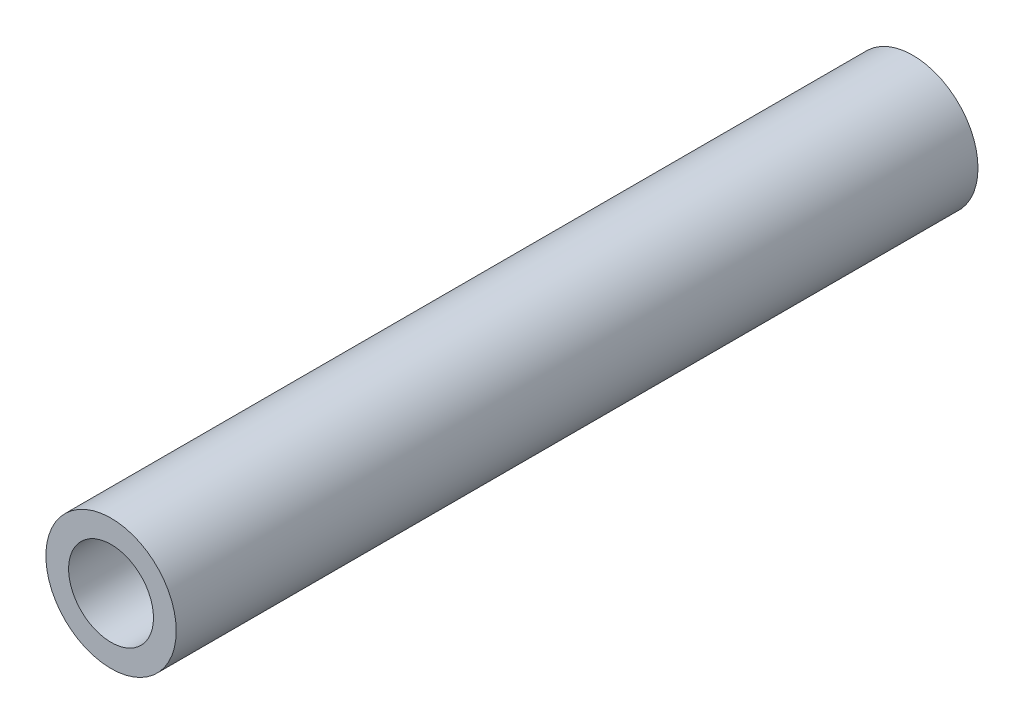
ISO-10303-21;
HEADER;
FILE_DESCRIPTION(('STEP AP214'),'2;1');
FILE_NAME('part.step','',(''),(''),'','','');
FILE_SCHEMA(('AUTOMOTIVE_DESIGN { 1 0 10303 214 1 1 1 1 }'));
ENDSEC;
DATA;
#1=APPLICATION_CONTEXT('core data for automotive mechanical design processes');
#2=APPLICATION_PROTOCOL_DEFINITION('international standard','automotive_design',2000,#1);
#3=PRODUCT_CONTEXT('',#1,'mechanical');
#4=PRODUCT('Part','Part','',(#3));
#5=PRODUCT_RELATED_PRODUCT_CATEGORY('part','',(#4));
#6=PRODUCT_DEFINITION_FORMATION('','',#4);
#7=PRODUCT_DEFINITION_CONTEXT('part definition',#1,'design');
#8=PRODUCT_DEFINITION('design','',#6,#7);
#9=PRODUCT_DEFINITION_SHAPE('','',#8);
#10=(LENGTH_UNIT() NAMED_UNIT(*) SI_UNIT(.MILLI.,.METRE.));
#11=(NAMED_UNIT(*) PLANE_ANGLE_UNIT() SI_UNIT($,.RADIAN.));
#12=(NAMED_UNIT(*) SI_UNIT($,.STERADIAN.) SOLID_ANGLE_UNIT());
#13=UNCERTAINTY_MEASURE_WITH_UNIT(LENGTH_MEASURE(1.E-05),#10,'distance_accuracy_value','');
#14=(GEOMETRIC_REPRESENTATION_CONTEXT(3) GLOBAL_UNCERTAINTY_ASSIGNED_CONTEXT((#13)) GLOBAL_UNIT_ASSIGNED_CONTEXT((#10,
#11,#12)) REPRESENTATION_CONTEXT('',''));
#15=CARTESIAN_POINT('',(0.,0.,0.));
#16=DIRECTION('',(0.,0.,1.));
#17=DIRECTION('',(1.,0.,0.));
#18=AXIS2_PLACEMENT_3D('',#15,#16,#17);
#19=CARTESIAN_POINT('',(-8.50000000000141,74.4000000000007,52.9));
#20=DIRECTION('',(0.,0.,1.));
#21=DIRECTION('',(1.,0.,0.));
#22=AXIS2_PLACEMENT_3D('',#19,#20,#21);
#23=PLANE('',#22);
#24=CARTESIAN_POINT('',(-8.50000000000141,74.4000000000007,52.9));
#25=DIRECTION('',(0.,0.,1.));
#26=DIRECTION('',(1.,0.,0.));
#27=AXIS2_PLACEMENT_3D('',#24,#25,#26);
#28=CIRCLE('',#27,4.3);
#29=CARTESIAN_POINT('',(-4.20000000000141,74.4000000000007,52.9));
#30=VERTEX_POINT('',#29);
#31=EDGE_CURVE('E10',#30,#30,#28,.T.);
#32=ORIENTED_EDGE('',*,*,#31,.T.);
#33=EDGE_LOOP('',(#32));
#34=FACE_BOUND('',#33,.T.);
#35=CARTESIAN_POINT('',(-8.50000000000141,74.4000000000007,52.9));
#36=DIRECTION('',(0.,0.,1.));
#37=DIRECTION('',(1.,0.,0.));
#38=AXIS2_PLACEMENT_3D('',#35,#36,#37);
#39=CIRCLE('',#38,2.8);
#40=CARTESIAN_POINT('',(-5.70000000000141,74.4000000000007,52.9));
#41=VERTEX_POINT('',#40);
#42=EDGE_CURVE('E39',#41,#41,#39,.T.);
#43=ORIENTED_EDGE('',*,*,#42,.F.);
#44=EDGE_LOOP('',(#43));
#45=FACE_BOUND('',#44,.T.);
#46=ADVANCED_FACE('F28',(#34,#45),#23,.T.);
#47=CARTESIAN_POINT('',(-8.50000000000141,74.4000000000007,0.));
#48=DIRECTION('',(0.,0.,1.));
#49=DIRECTION('',(1.,0.,0.));
#50=AXIS2_PLACEMENT_3D('',#47,#48,#49);
#51=PLANE('',#50);
#52=CARTESIAN_POINT('',(-8.50000000000141,74.4000000000007,0.));
#53=DIRECTION('',(0.,0.,1.));
#54=DIRECTION('',(1.,0.,0.));
#55=AXIS2_PLACEMENT_3D('',#52,#53,#54);
#56=CIRCLE('',#55,4.3);
#57=CARTESIAN_POINT('',(-4.20000000000141,74.4000000000007,0.));
#58=VERTEX_POINT('',#57);
#59=EDGE_CURVE('E32',#58,#58,#56,.T.);
#60=ORIENTED_EDGE('',*,*,#59,.F.);
#61=EDGE_LOOP('',(#60));
#62=FACE_BOUND('',#61,.T.);
#63=CARTESIAN_POINT('',(-8.50000000000141,74.4000000000007,0.));
#64=DIRECTION('',(0.,0.,1.));
#65=DIRECTION('',(1.,0.,0.));
#66=AXIS2_PLACEMENT_3D('',#63,#64,#65);
#67=CIRCLE('',#66,2.8);
#68=CARTESIAN_POINT('',(-5.70000000000141,74.4000000000007,0.));
#69=VERTEX_POINT('',#68);
#70=EDGE_CURVE('E41',#69,#69,#67,.T.);
#71=ORIENTED_EDGE('',*,*,#70,.T.);
#72=EDGE_LOOP('',(#71));
#73=FACE_BOUND('',#72,.T.);
#74=ADVANCED_FACE('F51',(#62,#73),#51,.F.);
#75=CARTESIAN_POINT('',(-8.50000000000141,74.4000000000007,52.9));
#76=DIRECTION('',(0.,0.,-1.));
#77=DIRECTION('',(-1.,0.,0.));
#78=AXIS2_PLACEMENT_3D('',#75,#76,#77);
#79=CYLINDRICAL_SURFACE('',#78,4.3);
#80=ORIENTED_EDGE('',*,*,#31,.F.);
#81=EDGE_LOOP('',(#80));
#82=FACE_BOUND('',#81,.T.);
#83=ORIENTED_EDGE('',*,*,#59,.T.);
#84=EDGE_LOOP('',(#83));
#85=FACE_BOUND('',#84,.T.);
#86=ADVANCED_FACE('F30',(#82,#85),#79,.T.);
#87=CARTESIAN_POINT('',(-8.50000000000141,74.4000000000007,52.9));
#88=DIRECTION('',(0.,0.,-1.));
#89=DIRECTION('',(-1.,0.,0.));
#90=AXIS2_PLACEMENT_3D('',#87,#88,#89);
#91=CYLINDRICAL_SURFACE('',#90,2.8);
#92=ORIENTED_EDGE('',*,*,#42,.T.);
#93=EDGE_LOOP('',(#92));
#94=FACE_BOUND('',#93,.T.);
#95=ORIENTED_EDGE('',*,*,#70,.F.);
#96=EDGE_LOOP('',(#95));
#97=FACE_BOUND('',#96,.T.);
#98=ADVANCED_FACE('F47',(#94,#97),#91,.F.);
#99=CLOSED_SHELL('',(#46,#74,#86,#98));
#100=MANIFOLD_SOLID_BREP('B2',#99);
#101=ADVANCED_BREP_SHAPE_REPRESENTATION('',(#18,#100),#14);
#102=SHAPE_DEFINITION_REPRESENTATION(#9,#101);
ENDSEC;
END-ISO-10303-21;
